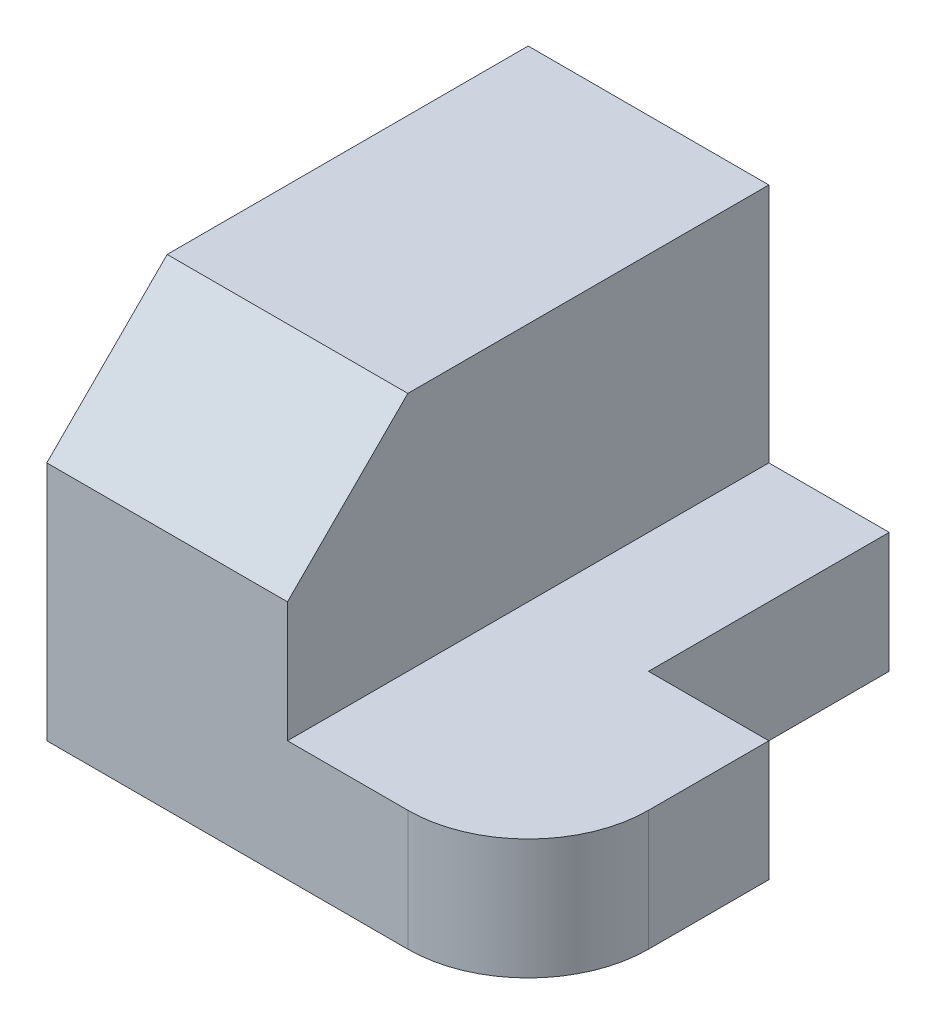
ISO-10303-21;
HEADER;
FILE_DESCRIPTION(('STEP AP214'),'2;1');
FILE_NAME('part.step','',(''),(''),'','','');
FILE_SCHEMA(('AUTOMOTIVE_DESIGN { 1 0 10303 214 1 1 1 1 }'));
ENDSEC;
DATA;
#1=APPLICATION_CONTEXT('core data for automotive mechanical design processes');
#2=APPLICATION_PROTOCOL_DEFINITION('international standard','automotive_design',2000,#1);
#3=PRODUCT_CONTEXT('',#1,'mechanical');
#4=PRODUCT('Part','Part','',(#3));
#5=PRODUCT_RELATED_PRODUCT_CATEGORY('part','',(#4));
#6=PRODUCT_DEFINITION_FORMATION('','',#4);
#7=PRODUCT_DEFINITION_CONTEXT('part definition',#1,'design');
#8=PRODUCT_DEFINITION('design','',#6,#7);
#9=PRODUCT_DEFINITION_SHAPE('','',#8);
#10=(LENGTH_UNIT() NAMED_UNIT(*) SI_UNIT(.MILLI.,.METRE.));
#11=(NAMED_UNIT(*) PLANE_ANGLE_UNIT() SI_UNIT($,.RADIAN.));
#12=(NAMED_UNIT(*) SI_UNIT($,.STERADIAN.) SOLID_ANGLE_UNIT());
#13=UNCERTAINTY_MEASURE_WITH_UNIT(LENGTH_MEASURE(1.E-05),#10,'distance_accuracy_value','');
#14=(GEOMETRIC_REPRESENTATION_CONTEXT(3) GLOBAL_UNCERTAINTY_ASSIGNED_CONTEXT((#13)) GLOBAL_UNIT_ASSIGNED_CONTEXT((#10,
#11,#12)) REPRESENTATION_CONTEXT('',''));
#15=CARTESIAN_POINT('',(0.,0.,0.));
#16=DIRECTION('',(0.,0.,1.));
#17=DIRECTION('',(1.,0.,0.));
#18=AXIS2_PLACEMENT_3D('',#15,#16,#17);
#19=CARTESIAN_POINT('',(10.,0.,0.));
#20=DIRECTION('',(0.,0.,1.));
#21=DIRECTION('',(1.,0.,0.));
#22=AXIS2_PLACEMENT_3D('',#19,#20,#21);
#23=PLANE('',#22);
#24=DIRECTION('',(0.,1.,0.));
#25=VECTOR('',#24,1.);
#26=CARTESIAN_POINT('',(0.,0.,0.));
#27=LINE('',#26,#25);
#28=CARTESIAN_POINT('',(0.,0.,0.));
#29=VERTEX_POINT('',#28);
#30=CARTESIAN_POINT('',(0.,15.,0.));
#31=VERTEX_POINT('',#30);
#32=EDGE_CURVE('E165',#29,#31,#27,.T.);
#33=ORIENTED_EDGE('',*,*,#32,.T.);
#34=DIRECTION('',(-1.,0.,0.));
#35=VECTOR('',#34,1.);
#36=CARTESIAN_POINT('',(10.,15.,0.));
#37=LINE('',#36,#35);
#38=CARTESIAN_POINT('',(10.,15.,0.));
#39=VERTEX_POINT('',#38);
#40=EDGE_CURVE('E11',#39,#31,#37,.T.);
#41=ORIENTED_EDGE('',*,*,#40,.F.);
#42=DIRECTION('',(0.,1.,0.));
#43=VECTOR('',#42,1.);
#44=CARTESIAN_POINT('',(10.,0.,0.));
#45=LINE('',#44,#43);
#46=CARTESIAN_POINT('',(10.,5.,0.));
#47=VERTEX_POINT('',#46);
#48=EDGE_CURVE('E80',#47,#39,#45,.T.);
#49=ORIENTED_EDGE('',*,*,#48,.F.);
#50=DIRECTION('',(-1.,0.,0.));
#51=VECTOR('',#50,1.);
#52=CARTESIAN_POINT('',(10.,5.,0.));
#53=LINE('',#52,#51);
#54=CARTESIAN_POINT('',(15.,5.,0.));
#55=VERTEX_POINT('',#54);
#56=EDGE_CURVE('E126',#55,#47,#53,.T.);
#57=ORIENTED_EDGE('',*,*,#56,.F.);
#58=DIRECTION('',(0.,-1.,0.));
#59=VECTOR('',#58,1.);
#60=CARTESIAN_POINT('',(15.,5.,0.));
#61=LINE('',#60,#59);
#62=CARTESIAN_POINT('',(15.,0.,0.));
#63=VERTEX_POINT('',#62);
#64=EDGE_CURVE('E144',#55,#63,#61,.T.);
#65=ORIENTED_EDGE('',*,*,#64,.T.);
#66=DIRECTION('',(-1.,0.,0.));
#67=VECTOR('',#66,1.);
#68=CARTESIAN_POINT('',(10.,0.,0.));
#69=LINE('',#68,#67);
#70=EDGE_CURVE('E118',#63,#29,#69,.T.);
#71=ORIENTED_EDGE('',*,*,#70,.T.);
#72=EDGE_LOOP('',(#33,#41,#49,#57,#65,#71));
#73=FACE_BOUND('',#72,.T.);
#74=ADVANCED_FACE('F33',(#73),#23,.F.);
#75=CARTESIAN_POINT('',(10.,15.,0.));
#76=DIRECTION('',(0.,-1.,0.));
#77=DIRECTION('',(0.,0.,-1.));
#78=AXIS2_PLACEMENT_3D('',#75,#76,#77);
#79=PLANE('',#78);
#80=DIRECTION('',(0.,0.,1.));
#81=VECTOR('',#80,1.);
#82=CARTESIAN_POINT('',(0.,15.,0.));
#83=LINE('',#82,#81);
#84=CARTESIAN_POINT('',(0.,15.,15.));
#85=VERTEX_POINT('',#84);
#86=EDGE_CURVE('E172',#31,#85,#83,.T.);
#87=ORIENTED_EDGE('',*,*,#86,.T.);
#88=DIRECTION('',(-1.,0.,0.));
#89=VECTOR('',#88,1.);
#90=CARTESIAN_POINT('',(10.,15.,15.));
#91=LINE('',#90,#89);
#92=CARTESIAN_POINT('',(10.,15.,15.));
#93=VERTEX_POINT('',#92);
#94=EDGE_CURVE('E40',#93,#85,#91,.T.);
#95=ORIENTED_EDGE('',*,*,#94,.F.);
#96=DIRECTION('',(0.,0.,1.));
#97=VECTOR('',#96,1.);
#98=CARTESIAN_POINT('',(10.,15.,0.));
#99=LINE('',#98,#97);
#100=EDGE_CURVE('E167',#39,#93,#99,.T.);
#101=ORIENTED_EDGE('',*,*,#100,.F.);
#102=ORIENTED_EDGE('',*,*,#40,.T.);
#103=EDGE_LOOP('',(#87,#95,#101,#102));
#104=FACE_BOUND('',#103,.T.);
#105=ADVANCED_FACE('F215',(#104),#79,.F.);
#106=CARTESIAN_POINT('',(10.,9.99999999999999,20.));
#107=DIRECTION('',(0.,-0.707106781186548,-0.707106781186548));
#108=DIRECTION('',(0.,0.707106781186548,-0.707106781186548));
#109=AXIS2_PLACEMENT_3D('',#106,#107,#108);
#110=PLANE('',#109);
#111=DIRECTION('',(0.,-0.707106781186547,0.707106781186547));
#112=VECTOR('',#111,1.);
#113=CARTESIAN_POINT('',(0.,9.99999999999999,20.));
#114=LINE('',#113,#112);
#115=CARTESIAN_POINT('',(0.,9.99999999999999,20.));
#116=VERTEX_POINT('',#115);
#117=EDGE_CURVE('E174',#85,#116,#114,.T.);
#118=ORIENTED_EDGE('',*,*,#117,.T.);
#119=DIRECTION('',(-1.,0.,0.));
#120=VECTOR('',#119,1.);
#121=CARTESIAN_POINT('',(10.,9.99999999999999,20.));
#122=LINE('',#121,#120);
#123=CARTESIAN_POINT('',(10.,9.99999999999999,20.));
#124=VERTEX_POINT('',#123);
#125=EDGE_CURVE('E182',#124,#116,#122,.T.);
#126=ORIENTED_EDGE('',*,*,#125,.F.);
#127=DIRECTION('',(0.,-0.707106781186547,0.707106781186547));
#128=VECTOR('',#127,1.);
#129=CARTESIAN_POINT('',(10.,9.99999999999999,20.));
#130=LINE('',#129,#128);
#131=EDGE_CURVE('E54',#93,#124,#130,.T.);
#132=ORIENTED_EDGE('',*,*,#131,.F.);
#133=ORIENTED_EDGE('',*,*,#94,.T.);
#134=EDGE_LOOP('',(#118,#126,#132,#133));
#135=FACE_BOUND('',#134,.T.);
#136=ADVANCED_FACE('F187',(#135),#110,.F.);
#137=CARTESIAN_POINT('',(10.,0.,20.));
#138=DIRECTION('',(0.,0.,-1.));
#139=DIRECTION('',(-1.,0.,0.));
#140=AXIS2_PLACEMENT_3D('',#137,#138,#139);
#141=PLANE('',#140);
#142=DIRECTION('',(0.,-1.,0.));
#143=VECTOR('',#142,1.);
#144=CARTESIAN_POINT('',(0.,0.,20.));
#145=LINE('',#144,#143);
#146=CARTESIAN_POINT('',(0.,0.,20.));
#147=VERTEX_POINT('',#146);
#148=EDGE_CURVE('E176',#116,#147,#145,.T.);
#149=ORIENTED_EDGE('',*,*,#148,.T.);
#150=DIRECTION('',(-1.,0.,0.));
#151=VECTOR('',#150,1.);
#152=CARTESIAN_POINT('',(10.,0.,20.));
#153=LINE('',#152,#151);
#154=CARTESIAN_POINT('',(15.,0.,20.));
#155=VERTEX_POINT('',#154);
#156=EDGE_CURVE('E180',#155,#147,#153,.T.);
#157=ORIENTED_EDGE('',*,*,#156,.F.);
#158=DIRECTION('',(0.,-1.,0.));
#159=VECTOR('',#158,1.);
#160=CARTESIAN_POINT('',(15.,5.,20.));
#161=LINE('',#160,#159);
#162=CARTESIAN_POINT('',(15.,5.,20.));
#163=VERTEX_POINT('',#162);
#164=EDGE_CURVE('E131',#163,#155,#161,.T.);
#165=ORIENTED_EDGE('',*,*,#164,.F.);
#166=DIRECTION('',(1.,0.,0.));
#167=VECTOR('',#166,1.);
#168=CARTESIAN_POINT('',(10.,5.,20.));
#169=LINE('',#168,#167);
#170=CARTESIAN_POINT('',(10.,5.,20.));
#171=VERTEX_POINT('',#170);
#172=EDGE_CURVE('E123',#171,#163,#169,.T.);
#173=ORIENTED_EDGE('',*,*,#172,.F.);
#174=DIRECTION('',(0.,-1.,0.));
#175=VECTOR('',#174,1.);
#176=CARTESIAN_POINT('',(10.,0.,20.));
#177=LINE('',#176,#175);
#178=EDGE_CURVE('E113',#124,#171,#177,.T.);
#179=ORIENTED_EDGE('',*,*,#178,.F.);
#180=ORIENTED_EDGE('',*,*,#125,.T.);
#181=EDGE_LOOP('',(#149,#157,#165,#173,#179,#180));
#182=FACE_BOUND('',#181,.T.);
#183=ADVANCED_FACE('F129',(#182),#141,.F.);
#184=CARTESIAN_POINT('',(10.,0.,0.));
#185=DIRECTION('',(0.,1.,0.));
#186=DIRECTION('',(0.,0.,1.));
#187=AXIS2_PLACEMENT_3D('',#184,#185,#186);
#188=PLANE('',#187);
#189=DIRECTION('',(0.,0.,-1.));
#190=VECTOR('',#189,1.);
#191=CARTESIAN_POINT('',(0.,0.,0.));
#192=LINE('',#191,#190);
#193=EDGE_CURVE('E78',#147,#29,#192,.T.);
#194=ORIENTED_EDGE('',*,*,#193,.T.);
#195=ORIENTED_EDGE('',*,*,#70,.F.);
#196=DIRECTION('',(0.,0.,-1.));
#197=VECTOR('',#196,1.);
#198=CARTESIAN_POINT('',(15.,0.,0.));
#199=LINE('',#198,#197);
#200=CARTESIAN_POINT('',(15.,0.,10.));
#201=VERTEX_POINT('',#200);
#202=EDGE_CURVE('E127',#201,#63,#199,.T.);
#203=ORIENTED_EDGE('',*,*,#202,.F.);
#204=DIRECTION('',(-1.,0.,0.));
#205=VECTOR('',#204,1.);
#206=CARTESIAN_POINT('',(15.,0.,10.));
#207=LINE('',#206,#205);
#208=CARTESIAN_POINT('',(20.,0.,10.));
#209=VERTEX_POINT('',#208);
#210=EDGE_CURVE('E149',#209,#201,#207,.T.);
#211=ORIENTED_EDGE('',*,*,#210,.F.);
#212=DIRECTION('',(0.,0.,-1.));
#213=VECTOR('',#212,1.);
#214=CARTESIAN_POINT('',(20.,0.,15.));
#215=LINE('',#214,#213);
#216=CARTESIAN_POINT('',(20.,0.,15.));
#217=VERTEX_POINT('',#216);
#218=EDGE_CURVE('E147',#217,#209,#215,.T.);
#219=ORIENTED_EDGE('',*,*,#218,.F.);
#220=CARTESIAN_POINT('',(15.,0.,15.));
#221=DIRECTION('',(0.,1.,0.));
#222=DIRECTION('',(0.,0.,-1.));
#223=AXIS2_PLACEMENT_3D('',#220,#221,#222);
#224=CIRCLE('',#223,5.);
#225=EDGE_CURVE('E145',#155,#217,#224,.T.);
#226=ORIENTED_EDGE('',*,*,#225,.F.);
#227=ORIENTED_EDGE('',*,*,#156,.T.);
#228=EDGE_LOOP('',(#194,#195,#203,#211,#219,#226,#227));
#229=FACE_BOUND('',#228,.T.);
#230=ADVANCED_FACE('F194',(#229),#188,.F.);
#231=CARTESIAN_POINT('',(10.,0.,0.));
#232=DIRECTION('',(1.,0.,0.));
#233=DIRECTION('',(0.,0.,-1.));
#234=AXIS2_PLACEMENT_3D('',#231,#232,#233);
#235=PLANE('',#234);
#236=DIRECTION('',(0.,0.,1.));
#237=VECTOR('',#236,1.);
#238=CARTESIAN_POINT('',(10.,5.,0.));
#239=LINE('',#238,#237);
#240=EDGE_CURVE('E47',#47,#171,#239,.T.);
#241=ORIENTED_EDGE('',*,*,#240,.F.);
#242=ORIENTED_EDGE('',*,*,#48,.T.);
#243=ORIENTED_EDGE('',*,*,#100,.T.);
#244=ORIENTED_EDGE('',*,*,#131,.T.);
#245=ORIENTED_EDGE('',*,*,#178,.T.);
#246=EDGE_LOOP('',(#241,#242,#243,#244,#245));
#247=FACE_BOUND('',#246,.T.);
#248=ADVANCED_FACE('F114',(#247),#235,.T.);
#249=CARTESIAN_POINT('',(0.,0.,0.));
#250=DIRECTION('',(1.,0.,0.));
#251=DIRECTION('',(0.,0.,-1.));
#252=AXIS2_PLACEMENT_3D('',#249,#250,#251);
#253=PLANE('',#252);
#254=ORIENTED_EDGE('',*,*,#32,.F.);
#255=ORIENTED_EDGE('',*,*,#193,.F.);
#256=ORIENTED_EDGE('',*,*,#148,.F.);
#257=ORIENTED_EDGE('',*,*,#117,.F.);
#258=ORIENTED_EDGE('',*,*,#86,.F.);
#259=EDGE_LOOP('',(#254,#255,#256,#257,#258));
#260=FACE_BOUND('',#259,.T.);
#261=ADVANCED_FACE('F192',(#260),#253,.F.);
#262=CARTESIAN_POINT('',(15.,5.,15.));
#263=DIRECTION('',(0.,-1.,0.));
#264=DIRECTION('',(0.,0.,-1.));
#265=AXIS2_PLACEMENT_3D('',#262,#263,#264);
#266=CYLINDRICAL_SURFACE('',#265,5.);
#267=ORIENTED_EDGE('',*,*,#225,.T.);
#268=DIRECTION('',(0.,-1.,0.));
#269=VECTOR('',#268,1.);
#270=CARTESIAN_POINT('',(20.,5.,15.));
#271=LINE('',#270,#269);
#272=CARTESIAN_POINT('',(20.,5.,15.));
#273=VERTEX_POINT('',#272);
#274=EDGE_CURVE('E161',#273,#217,#271,.T.);
#275=ORIENTED_EDGE('',*,*,#274,.F.);
#276=CARTESIAN_POINT('',(15.,5.,15.));
#277=DIRECTION('',(0.,1.,0.));
#278=DIRECTION('',(0.,0.,-1.));
#279=AXIS2_PLACEMENT_3D('',#276,#277,#278);
#280=CIRCLE('',#279,5.);
#281=EDGE_CURVE('E133',#163,#273,#280,.T.);
#282=ORIENTED_EDGE('',*,*,#281,.F.);
#283=ORIENTED_EDGE('',*,*,#164,.T.);
#284=EDGE_LOOP('',(#267,#275,#282,#283));
#285=FACE_BOUND('',#284,.T.);
#286=ADVANCED_FACE('F199',(#285),#266,.T.);
#287=CARTESIAN_POINT('',(20.,5.,15.));
#288=DIRECTION('',(-1.,0.,0.));
#289=DIRECTION('',(0.,0.,1.));
#290=AXIS2_PLACEMENT_3D('',#287,#288,#289);
#291=PLANE('',#290);
#292=ORIENTED_EDGE('',*,*,#218,.T.);
#293=DIRECTION('',(0.,-1.,0.));
#294=VECTOR('',#293,1.);
#295=CARTESIAN_POINT('',(20.,5.,10.));
#296=LINE('',#295,#294);
#297=CARTESIAN_POINT('',(20.,5.,10.));
#298=VERTEX_POINT('',#297);
#299=EDGE_CURVE('E158',#298,#209,#296,.T.);
#300=ORIENTED_EDGE('',*,*,#299,.F.);
#301=DIRECTION('',(0.,0.,-1.));
#302=VECTOR('',#301,1.);
#303=CARTESIAN_POINT('',(20.,5.,15.));
#304=LINE('',#303,#302);
#305=EDGE_CURVE('E135',#273,#298,#304,.T.);
#306=ORIENTED_EDGE('',*,*,#305,.F.);
#307=ORIENTED_EDGE('',*,*,#274,.T.);
#308=EDGE_LOOP('',(#292,#300,#306,#307));
#309=FACE_BOUND('',#308,.T.);
#310=ADVANCED_FACE('F202',(#309),#291,.F.);
#311=CARTESIAN_POINT('',(15.,5.,10.));
#312=DIRECTION('',(0.,0.,1.));
#313=DIRECTION('',(1.,0.,0.));
#314=AXIS2_PLACEMENT_3D('',#311,#312,#313);
#315=PLANE('',#314);
#316=ORIENTED_EDGE('',*,*,#210,.T.);
#317=DIRECTION('',(0.,-1.,0.));
#318=VECTOR('',#317,1.);
#319=CARTESIAN_POINT('',(15.,5.,10.));
#320=LINE('',#319,#318);
#321=CARTESIAN_POINT('',(15.,5.,10.));
#322=VERTEX_POINT('',#321);
#323=EDGE_CURVE('E155',#322,#201,#320,.T.);
#324=ORIENTED_EDGE('',*,*,#323,.F.);
#325=DIRECTION('',(-1.,0.,0.));
#326=VECTOR('',#325,1.);
#327=CARTESIAN_POINT('',(15.,5.,10.));
#328=LINE('',#327,#326);
#329=EDGE_CURVE('E139',#298,#322,#328,.T.);
#330=ORIENTED_EDGE('',*,*,#329,.F.);
#331=ORIENTED_EDGE('',*,*,#299,.T.);
#332=EDGE_LOOP('',(#316,#324,#330,#331));
#333=FACE_BOUND('',#332,.T.);
#334=ADVANCED_FACE('F209',(#333),#315,.F.);
#335=CARTESIAN_POINT('',(15.,5.,0.));
#336=DIRECTION('',(-1.,0.,0.));
#337=DIRECTION('',(0.,0.,1.));
#338=AXIS2_PLACEMENT_3D('',#335,#336,#337);
#339=PLANE('',#338);
#340=ORIENTED_EDGE('',*,*,#202,.T.);
#341=ORIENTED_EDGE('',*,*,#64,.F.);
#342=DIRECTION('',(0.,0.,-1.));
#343=VECTOR('',#342,1.);
#344=CARTESIAN_POINT('',(15.,5.,0.));
#345=LINE('',#344,#343);
#346=EDGE_CURVE('E141',#322,#55,#345,.T.);
#347=ORIENTED_EDGE('',*,*,#346,.F.);
#348=ORIENTED_EDGE('',*,*,#323,.T.);
#349=EDGE_LOOP('',(#340,#341,#347,#348));
#350=FACE_BOUND('',#349,.T.);
#351=ADVANCED_FACE('F212',(#350),#339,.F.);
#352=CARTESIAN_POINT('',(15.,5.,15.));
#353=DIRECTION('',(0.,-1.,0.));
#354=DIRECTION('',(0.,0.,-1.));
#355=AXIS2_PLACEMENT_3D('',#352,#353,#354);
#356=PLANE('',#355);
#357=ORIENTED_EDGE('',*,*,#240,.T.);
#358=ORIENTED_EDGE('',*,*,#172,.T.);
#359=ORIENTED_EDGE('',*,*,#281,.T.);
#360=ORIENTED_EDGE('',*,*,#305,.T.);
#361=ORIENTED_EDGE('',*,*,#329,.T.);
#362=ORIENTED_EDGE('',*,*,#346,.T.);
#363=ORIENTED_EDGE('',*,*,#56,.T.);
#364=EDGE_LOOP('',(#357,#358,#359,#360,#361,#362,#363));
#365=FACE_BOUND('',#364,.T.);
#366=ADVANCED_FACE('F122',(#365),#356,.F.);
#367=CLOSED_SHELL('',(#74,#105,#136,#183,#230,#248,#261,#286,#310,#334,#351,#366));
#368=MANIFOLD_SOLID_BREP('B2',#367);
#369=ADVANCED_BREP_SHAPE_REPRESENTATION('',(#18,#368),#14);
#370=SHAPE_DEFINITION_REPRESENTATION(#9,#369);
ENDSEC;
END-ISO-10303-21;
